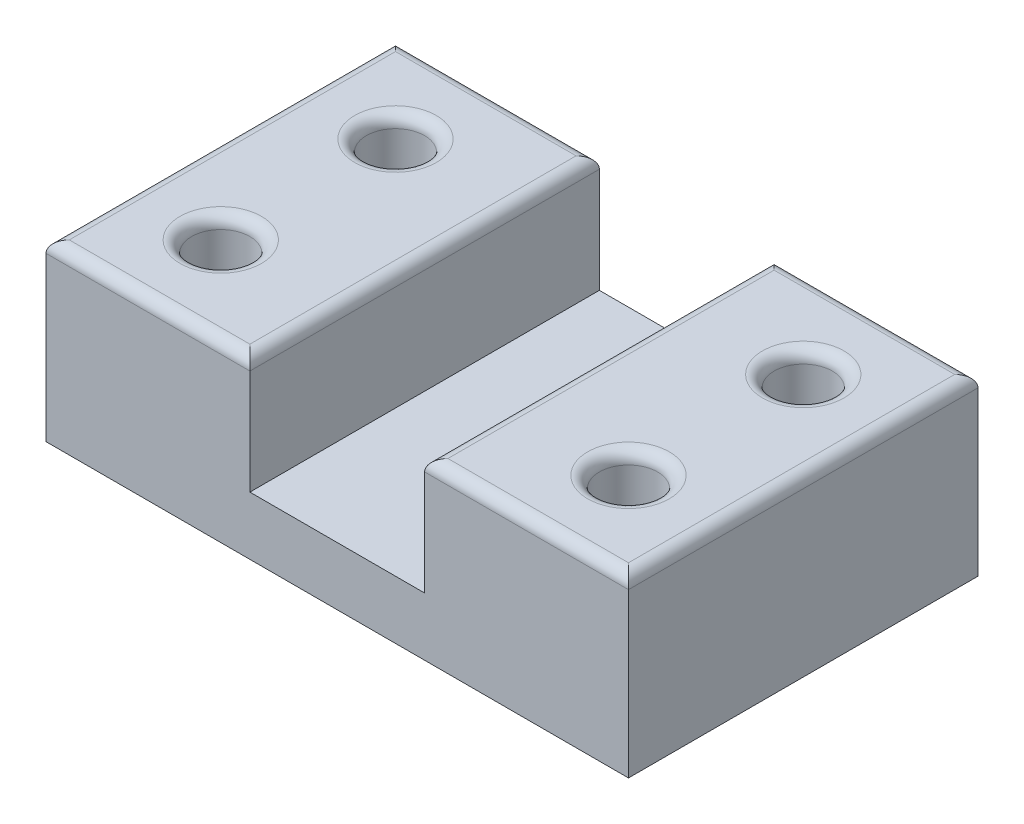
ISO-10303-21;
HEADER;
FILE_DESCRIPTION(('STEP AP214'),'2;1');
FILE_NAME('part.step','',(''),(''),'','','');
FILE_SCHEMA(('AUTOMOTIVE_DESIGN { 1 0 10303 214 1 1 1 1 }'));
ENDSEC;
DATA;
#1=APPLICATION_CONTEXT('core data for automotive mechanical design processes');
#2=APPLICATION_PROTOCOL_DEFINITION('international standard','automotive_design',2000,#1);
#3=PRODUCT_CONTEXT('',#1,'mechanical');
#4=PRODUCT('Part','Part','',(#3));
#5=PRODUCT_RELATED_PRODUCT_CATEGORY('part','',(#4));
#6=PRODUCT_DEFINITION_FORMATION('','',#4);
#7=PRODUCT_DEFINITION_CONTEXT('part definition',#1,'design');
#8=PRODUCT_DEFINITION('design','',#6,#7);
#9=PRODUCT_DEFINITION_SHAPE('','',#8);
#10=(LENGTH_UNIT() NAMED_UNIT(*) SI_UNIT(.MILLI.,.METRE.));
#11=(NAMED_UNIT(*) PLANE_ANGLE_UNIT() SI_UNIT($,.RADIAN.));
#12=(NAMED_UNIT(*) SI_UNIT($,.STERADIAN.) SOLID_ANGLE_UNIT());
#13=UNCERTAINTY_MEASURE_WITH_UNIT(LENGTH_MEASURE(1.E-05),#10,'distance_accuracy_value','');
#14=(GEOMETRIC_REPRESENTATION_CONTEXT(3) GLOBAL_UNCERTAINTY_ASSIGNED_CONTEXT((#13)) GLOBAL_UNIT_ASSIGNED_CONTEXT((#10,
#11,#12)) REPRESENTATION_CONTEXT('',''));
#15=CARTESIAN_POINT('',(0.,0.,0.));
#16=DIRECTION('',(0.,0.,1.));
#17=DIRECTION('',(1.,0.,0.));
#18=AXIS2_PLACEMENT_3D('',#15,#16,#17);
#19=CARTESIAN_POINT('',(-12.257964558671,25.4,76.2));
#20=DIRECTION('',(0.,-1.,0.));
#21=DIRECTION('',(1.,0.,0.));
#22=AXIS2_PLACEMENT_3D('',#19,#20,#21);
#23=PLANE('',#22);
#24=DIRECTION('',(-1.,0.,0.));
#25=VECTOR('',#24,1.);
#26=CARTESIAN_POINT('',(-12.257964558671,25.4,73.66));
#27=LINE('',#26,#25);
#28=CARTESIAN_POINT('',(-54.167964558671,25.4,73.66));
#29=VERTEX_POINT('',#28);
#30=CARTESIAN_POINT('',(-14.797964558671,25.4,73.66));
#31=VERTEX_POINT('',#30);
#32=EDGE_CURVE('E59',#29,#31,#27,.F.);
#33=ORIENTED_EDGE('',*,*,#32,.T.);
#34=DIRECTION('',(0.,0.,-1.));
#35=VECTOR('',#34,1.);
#36=CARTESIAN_POINT('',(-14.797964558671,25.4,76.2));
#37=LINE('',#36,#35);
#38=CARTESIAN_POINT('',(-14.797964558671,25.4,2.54));
#39=VERTEX_POINT('',#38);
#40=EDGE_CURVE('E267',#31,#39,#37,.T.);
#41=ORIENTED_EDGE('',*,*,#40,.T.);
#42=DIRECTION('',(-1.,0.,0.));
#43=VECTOR('',#42,1.);
#44=CARTESIAN_POINT('',(-12.257964558671,25.4,2.54));
#45=LINE('',#44,#43);
#46=CARTESIAN_POINT('',(-54.167964558671,25.4,2.54));
#47=VERTEX_POINT('',#46);
#48=EDGE_CURVE('E260',#39,#47,#45,.T.);
#49=ORIENTED_EDGE('',*,*,#48,.T.);
#50=DIRECTION('',(0.,0.,-1.));
#51=VECTOR('',#50,1.);
#52=CARTESIAN_POINT('',(-54.167964558671,25.4,76.2));
#53=LINE('',#52,#51);
#54=EDGE_CURVE('E64',#47,#29,#53,.F.);
#55=ORIENTED_EDGE('',*,*,#54,.T.);
#56=EDGE_LOOP('',(#33,#41,#49,#55));
#57=FACE_BOUND('',#56,.T.);
#58=CARTESIAN_POINT('',(-37.657964558671,25.4,19.05));
#59=DIRECTION('',(0.,-1.,0.));
#60=DIRECTION('',(1.,0.,0.));
#61=AXIS2_PLACEMENT_3D('',#58,#59,#60);
#62=CIRCLE('',#61,8.89);
#63=CARTESIAN_POINT('',(-28.767964558671,25.4,19.05));
#64=VERTEX_POINT('',#63);
#65=EDGE_CURVE('E256',#64,#64,#62,.T.);
#66=ORIENTED_EDGE('',*,*,#65,.T.);
#67=EDGE_LOOP('',(#66));
#68=FACE_BOUND('',#67,.T.);
#69=CARTESIAN_POINT('',(-37.657964558671,25.4,57.15));
#70=DIRECTION('',(0.,-1.,0.));
#71=DIRECTION('',(1.,0.,0.));
#72=AXIS2_PLACEMENT_3D('',#69,#70,#71);
#73=CIRCLE('',#72,8.89);
#74=CARTESIAN_POINT('',(-28.767964558671,25.4,57.15));
#75=VERTEX_POINT('',#74);
#76=EDGE_CURVE('E252',#75,#75,#73,.T.);
#77=ORIENTED_EDGE('',*,*,#76,.T.);
#78=EDGE_LOOP('',(#77));
#79=FACE_BOUND('',#78,.T.);
#80=ADVANCED_FACE('F41',(#57,#68,#79),#23,.F.);
#81=CARTESIAN_POINT('',(-56.707964558671,25.4,76.2));
#82=DIRECTION('',(1.,0.,0.));
#83=DIRECTION('',(0.,0.,-1.));
#84=AXIS2_PLACEMENT_3D('',#81,#82,#83);
#85=PLANE('',#84);
#86=DIRECTION('',(0.,-1.,0.));
#87=VECTOR('',#86,1.);
#88=CARTESIAN_POINT('',(-56.707964558671,25.4,76.2));
#89=LINE('',#88,#87);
#90=CARTESIAN_POINT('',(-56.707964558671,22.86,76.2));
#91=VERTEX_POINT('',#90);
#92=CARTESIAN_POINT('',(-56.707964558671,-12.7,76.2));
#93=VERTEX_POINT('',#92);
#94=EDGE_CURVE('E132',#91,#93,#89,.T.);
#95=ORIENTED_EDGE('',*,*,#94,.F.);
#96=DIRECTION('',(0.,0.,-1.));
#97=VECTOR('',#96,1.);
#98=CARTESIAN_POINT('',(-56.707964558671,22.86,76.2));
#99=LINE('',#98,#97);
#100=CARTESIAN_POINT('',(-56.707964558671,22.86,0.));
#101=VERTEX_POINT('',#100);
#102=EDGE_CURVE('E274',#91,#101,#99,.T.);
#103=ORIENTED_EDGE('',*,*,#102,.T.);
#104=DIRECTION('',(0.,-1.,0.));
#105=VECTOR('',#104,1.);
#106=CARTESIAN_POINT('',(-56.707964558671,25.4,0.));
#107=LINE('',#106,#105);
#108=CARTESIAN_POINT('',(-56.707964558671,-12.7,0.));
#109=VERTEX_POINT('',#108);
#110=EDGE_CURVE('E151',#101,#109,#107,.T.);
#111=ORIENTED_EDGE('',*,*,#110,.T.);
#112=DIRECTION('',(0.,0.,-1.));
#113=VECTOR('',#112,1.);
#114=CARTESIAN_POINT('',(-56.707964558671,-12.7,76.2));
#115=LINE('',#114,#113);
#116=EDGE_CURVE('E148',#93,#109,#115,.T.);
#117=ORIENTED_EDGE('',*,*,#116,.F.);
#118=EDGE_LOOP('',(#95,#103,#111,#117));
#119=FACE_BOUND('',#118,.T.);
#120=ADVANCED_FACE('F149',(#119),#85,.F.);
#121=CARTESIAN_POINT('',(-56.707964558671,-12.7,76.2));
#122=DIRECTION('',(0.,1.,0.));
#123=DIRECTION('',(0.,0.,1.));
#124=AXIS2_PLACEMENT_3D('',#121,#122,#123);
#125=PLANE('',#124);
#126=CARTESIAN_POINT('',(-37.657964558671,-12.7,57.15));
#127=DIRECTION('',(0.,1.,0.));
#128=DIRECTION('',(-1.,0.,0.));
#129=AXIS2_PLACEMENT_3D('',#126,#127,#128);
#130=CIRCLE('',#129,6.35);
#131=CARTESIAN_POINT('',(-44.007964558671,-12.7,57.15));
#132=VERTEX_POINT('',#131);
#133=EDGE_CURVE('E378',#132,#132,#130,.T.);
#134=ORIENTED_EDGE('',*,*,#133,.T.);
#135=EDGE_LOOP('',(#134));
#136=FACE_BOUND('',#135,.T.);
#137=CARTESIAN_POINT('',(51.242035441329,-12.7,19.05));
#138=DIRECTION('',(0.,1.,0.));
#139=DIRECTION('',(-1.,0.,0.));
#140=AXIS2_PLACEMENT_3D('',#137,#138,#139);
#141=CIRCLE('',#140,6.35);
#142=CARTESIAN_POINT('',(44.892035441329,-12.7,19.05));
#143=VERTEX_POINT('',#142);
#144=EDGE_CURVE('E381',#143,#143,#141,.T.);
#145=ORIENTED_EDGE('',*,*,#144,.T.);
#146=EDGE_LOOP('',(#145));
#147=FACE_BOUND('',#146,.T.);
#148=CARTESIAN_POINT('',(51.242035441329,-12.7,57.15));
#149=DIRECTION('',(0.,1.,0.));
#150=DIRECTION('',(-1.,0.,0.));
#151=AXIS2_PLACEMENT_3D('',#148,#149,#150);
#152=CIRCLE('',#151,6.35);
#153=CARTESIAN_POINT('',(44.892035441329,-12.7,57.15));
#154=VERTEX_POINT('',#153);
#155=EDGE_CURVE('E294',#154,#154,#152,.T.);
#156=ORIENTED_EDGE('',*,*,#155,.T.);
#157=EDGE_LOOP('',(#156));
#158=FACE_BOUND('',#157,.T.);
#159=CARTESIAN_POINT('',(-37.657964558671,-12.7,19.05));
#160=DIRECTION('',(0.,1.,0.));
#161=DIRECTION('',(-1.,0.,0.));
#162=AXIS2_PLACEMENT_3D('',#159,#160,#161);
#163=CIRCLE('',#162,6.35);
#164=CARTESIAN_POINT('',(-44.007964558671,-12.7,19.05));
#165=VERTEX_POINT('',#164);
#166=EDGE_CURVE('E181',#165,#165,#163,.T.);
#167=ORIENTED_EDGE('',*,*,#166,.T.);
#168=EDGE_LOOP('',(#167));
#169=FACE_BOUND('',#168,.T.);
#170=DIRECTION('',(1.,0.,0.));
#171=VECTOR('',#170,1.);
#172=CARTESIAN_POINT('',(-56.707964558671,-12.7,0.));
#173=LINE('',#172,#171);
#174=CARTESIAN_POINT('',(70.292035441329,-12.7,0.));
#175=VERTEX_POINT('',#174);
#176=EDGE_CURVE('E180',#109,#175,#173,.T.);
#177=ORIENTED_EDGE('',*,*,#176,.T.);
#178=DIRECTION('',(0.,0.,-1.));
#179=VECTOR('',#178,1.);
#180=CARTESIAN_POINT('',(70.292035441329,-12.7,76.2));
#181=LINE('',#180,#179);
#182=CARTESIAN_POINT('',(70.292035441329,-12.7,76.2));
#183=VERTEX_POINT('',#182);
#184=EDGE_CURVE('E156',#183,#175,#181,.T.);
#185=ORIENTED_EDGE('',*,*,#184,.F.);
#186=DIRECTION('',(1.,0.,0.));
#187=VECTOR('',#186,1.);
#188=CARTESIAN_POINT('',(-56.707964558671,-12.7,76.2));
#189=LINE('',#188,#187);
#190=EDGE_CURVE('E137',#93,#183,#189,.T.);
#191=ORIENTED_EDGE('',*,*,#190,.F.);
#192=ORIENTED_EDGE('',*,*,#116,.T.);
#193=EDGE_LOOP('',(#177,#185,#191,#192));
#194=FACE_BOUND('',#193,.T.);
#195=ADVANCED_FACE('F158',(#136,#147,#158,#169,#194),#125,.F.);
#196=CARTESIAN_POINT('',(70.292035441329,-12.7,76.2));
#197=DIRECTION('',(-1.,0.,0.));
#198=DIRECTION('',(0.,0.,1.));
#199=AXIS2_PLACEMENT_3D('',#196,#197,#198);
#200=PLANE('',#199);
#201=DIRECTION('',(0.,1.,0.));
#202=VECTOR('',#201,1.);
#203=CARTESIAN_POINT('',(70.292035441329,-12.7,0.));
#204=LINE('',#203,#202);
#205=CARTESIAN_POINT('',(70.292035441329,22.86,0.));
#206=VERTEX_POINT('',#205);
#207=EDGE_CURVE('E184',#175,#206,#204,.T.);
#208=ORIENTED_EDGE('',*,*,#207,.T.);
#209=DIRECTION('',(0.,0.,-1.));
#210=VECTOR('',#209,1.);
#211=CARTESIAN_POINT('',(70.292035441329,22.86,76.2));
#212=LINE('',#211,#210);
#213=CARTESIAN_POINT('',(70.292035441329,22.86,76.2));
#214=VERTEX_POINT('',#213);
#215=EDGE_CURVE('E226',#206,#214,#212,.F.);
#216=ORIENTED_EDGE('',*,*,#215,.T.);
#217=DIRECTION('',(0.,1.,0.));
#218=VECTOR('',#217,1.);
#219=CARTESIAN_POINT('',(70.292035441329,-12.7,76.2));
#220=LINE('',#219,#218);
#221=EDGE_CURVE('E162',#183,#214,#220,.T.);
#222=ORIENTED_EDGE('',*,*,#221,.F.);
#223=ORIENTED_EDGE('',*,*,#184,.T.);
#224=EDGE_LOOP('',(#208,#216,#222,#223));
#225=FACE_BOUND('',#224,.T.);
#226=ADVANCED_FACE('F319',(#225),#200,.F.);
#227=CARTESIAN_POINT('',(70.292035441329,25.4,76.2));
#228=DIRECTION('',(0.,-1.,0.));
#229=DIRECTION('',(1.,0.,0.));
#230=AXIS2_PLACEMENT_3D('',#227,#228,#229);
#231=PLANE('',#230);
#232=DIRECTION('',(-1.,0.,0.));
#233=VECTOR('',#232,1.);
#234=CARTESIAN_POINT('',(70.292035441329,25.4,73.66));
#235=LINE('',#234,#233);
#236=CARTESIAN_POINT('',(28.382035441329,25.4,73.66));
#237=VERTEX_POINT('',#236);
#238=CARTESIAN_POINT('',(67.752035441329,25.4,73.66));
#239=VERTEX_POINT('',#238);
#240=EDGE_CURVE('E219',#237,#239,#235,.F.);
#241=ORIENTED_EDGE('',*,*,#240,.T.);
#242=DIRECTION('',(0.,0.,-1.));
#243=VECTOR('',#242,1.);
#244=CARTESIAN_POINT('',(67.752035441329,25.4,76.2));
#245=LINE('',#244,#243);
#246=CARTESIAN_POINT('',(67.752035441329,25.4,2.54));
#247=VERTEX_POINT('',#246);
#248=EDGE_CURVE('E222',#239,#247,#245,.T.);
#249=ORIENTED_EDGE('',*,*,#248,.T.);
#250=DIRECTION('',(-1.,0.,0.));
#251=VECTOR('',#250,1.);
#252=CARTESIAN_POINT('',(70.292035441329,25.4,2.54));
#253=LINE('',#252,#251);
#254=CARTESIAN_POINT('',(28.382035441329,25.4,2.54));
#255=VERTEX_POINT('',#254);
#256=EDGE_CURVE('E213',#247,#255,#253,.T.);
#257=ORIENTED_EDGE('',*,*,#256,.T.);
#258=DIRECTION('',(0.,0.,-1.));
#259=VECTOR('',#258,1.);
#260=CARTESIAN_POINT('',(28.382035441329,25.4,76.2));
#261=LINE('',#260,#259);
#262=EDGE_CURVE('E216',#255,#237,#261,.F.);
#263=ORIENTED_EDGE('',*,*,#262,.T.);
#264=EDGE_LOOP('',(#241,#249,#257,#263));
#265=FACE_BOUND('',#264,.T.);
#266=CARTESIAN_POINT('',(51.242035441329,25.4,57.15));
#267=DIRECTION('',(0.,-1.,0.));
#268=DIRECTION('',(1.,0.,0.));
#269=AXIS2_PLACEMENT_3D('',#266,#267,#268);
#270=CIRCLE('',#269,8.89);
#271=CARTESIAN_POINT('',(60.132035441329,25.4,57.15));
#272=VERTEX_POINT('',#271);
#273=EDGE_CURVE('E209',#272,#272,#270,.T.);
#274=ORIENTED_EDGE('',*,*,#273,.T.);
#275=EDGE_LOOP('',(#274));
#276=FACE_BOUND('',#275,.T.);
#277=CARTESIAN_POINT('',(51.242035441329,25.4,19.05));
#278=DIRECTION('',(0.,-1.,0.));
#279=DIRECTION('',(1.,0.,0.));
#280=AXIS2_PLACEMENT_3D('',#277,#278,#279);
#281=CIRCLE('',#280,8.89);
#282=CARTESIAN_POINT('',(60.132035441329,25.4,19.05));
#283=VERTEX_POINT('',#282);
#284=EDGE_CURVE('E155',#283,#283,#281,.T.);
#285=ORIENTED_EDGE('',*,*,#284,.T.);
#286=EDGE_LOOP('',(#285));
#287=FACE_BOUND('',#286,.T.);
#288=ADVANCED_FACE('F340',(#265,#276,#287),#231,.F.);
#289=CARTESIAN_POINT('',(25.842035441329,25.4,76.2));
#290=DIRECTION('',(1.,0.,0.));
#291=DIRECTION('',(0.,1.,0.));
#292=AXIS2_PLACEMENT_3D('',#289,#290,#291);
#293=PLANE('',#292);
#294=DIRECTION('',(0.,-1.,0.));
#295=VECTOR('',#294,1.);
#296=CARTESIAN_POINT('',(25.842035441329,25.4,76.2));
#297=LINE('',#296,#295);
#298=CARTESIAN_POINT('',(25.842035441329,22.86,76.2));
#299=VERTEX_POINT('',#298);
#300=CARTESIAN_POINT('',(25.842035441329,0.,76.2));
#301=VERTEX_POINT('',#300);
#302=EDGE_CURVE('E165',#299,#301,#297,.T.);
#303=ORIENTED_EDGE('',*,*,#302,.F.);
#304=DIRECTION('',(0.,0.,-1.));
#305=VECTOR('',#304,1.);
#306=CARTESIAN_POINT('',(25.842035441329,22.86,76.2));
#307=LINE('',#306,#305);
#308=CARTESIAN_POINT('',(25.842035441329,22.86,0.));
#309=VERTEX_POINT('',#308);
#310=EDGE_CURVE('E235',#299,#309,#307,.T.);
#311=ORIENTED_EDGE('',*,*,#310,.T.);
#312=DIRECTION('',(0.,-1.,0.));
#313=VECTOR('',#312,1.);
#314=CARTESIAN_POINT('',(25.842035441329,25.4,0.));
#315=LINE('',#314,#313);
#316=CARTESIAN_POINT('',(25.842035441329,0.,0.));
#317=VERTEX_POINT('',#316);
#318=EDGE_CURVE('E188',#309,#317,#315,.T.);
#319=ORIENTED_EDGE('',*,*,#318,.T.);
#320=DIRECTION('',(0.,0.,-1.));
#321=VECTOR('',#320,1.);
#322=CARTESIAN_POINT('',(25.842035441329,0.,76.2));
#323=LINE('',#322,#321);
#324=EDGE_CURVE('E200',#301,#317,#323,.T.);
#325=ORIENTED_EDGE('',*,*,#324,.F.);
#326=EDGE_LOOP('',(#303,#311,#319,#325));
#327=FACE_BOUND('',#326,.T.);
#328=ADVANCED_FACE('F328',(#327),#293,.F.);
#329=CARTESIAN_POINT('',(25.842035441329,0.,76.2));
#330=DIRECTION('',(0.,-1.,0.));
#331=DIRECTION('',(1.,0.,0.));
#332=AXIS2_PLACEMENT_3D('',#329,#330,#331);
#333=PLANE('',#332);
#334=DIRECTION('',(-1.,0.,0.));
#335=VECTOR('',#334,1.);
#336=CARTESIAN_POINT('',(25.842035441329,0.,0.));
#337=LINE('',#336,#335);
#338=CARTESIAN_POINT('',(-12.257964558671,0.,0.));
#339=VERTEX_POINT('',#338);
#340=EDGE_CURVE('E191',#317,#339,#337,.T.);
#341=ORIENTED_EDGE('',*,*,#340,.T.);
#342=DIRECTION('',(0.,0.,-1.));
#343=VECTOR('',#342,1.);
#344=CARTESIAN_POINT('',(-12.257964558671,0.,76.2));
#345=LINE('',#344,#343);
#346=CARTESIAN_POINT('',(-12.257964558671,0.,76.2));
#347=VERTEX_POINT('',#346);
#348=EDGE_CURVE('E177',#347,#339,#345,.T.);
#349=ORIENTED_EDGE('',*,*,#348,.F.);
#350=DIRECTION('',(-1.,0.,0.));
#351=VECTOR('',#350,1.);
#352=CARTESIAN_POINT('',(25.842035441329,0.,76.2));
#353=LINE('',#352,#351);
#354=EDGE_CURVE('E171',#301,#347,#353,.T.);
#355=ORIENTED_EDGE('',*,*,#354,.F.);
#356=ORIENTED_EDGE('',*,*,#324,.T.);
#357=EDGE_LOOP('',(#341,#349,#355,#356));
#358=FACE_BOUND('',#357,.T.);
#359=ADVANCED_FACE('F348',(#358),#333,.F.);
#360=CARTESIAN_POINT('',(-12.257964558671,0.,76.2));
#361=DIRECTION('',(-1.,0.,0.));
#362=DIRECTION('',(0.,-1.,0.));
#363=AXIS2_PLACEMENT_3D('',#360,#361,#362);
#364=PLANE('',#363);
#365=DIRECTION('',(0.,1.,0.));
#366=VECTOR('',#365,1.);
#367=CARTESIAN_POINT('',(-12.257964558671,0.,0.));
#368=LINE('',#367,#366);
#369=CARTESIAN_POINT('',(-12.257964558671,22.86,0.));
#370=VERTEX_POINT('',#369);
#371=EDGE_CURVE('E145',#339,#370,#368,.T.);
#372=ORIENTED_EDGE('',*,*,#371,.T.);
#373=DIRECTION('',(0.,0.,-1.));
#374=VECTOR('',#373,1.);
#375=CARTESIAN_POINT('',(-12.257964558671,22.86,76.2));
#376=LINE('',#375,#374);
#377=CARTESIAN_POINT('',(-12.257964558671,22.86,76.2));
#378=VERTEX_POINT('',#377);
#379=EDGE_CURVE('E270',#370,#378,#376,.F.);
#380=ORIENTED_EDGE('',*,*,#379,.T.);
#381=DIRECTION('',(0.,1.,0.));
#382=VECTOR('',#381,1.);
#383=CARTESIAN_POINT('',(-12.257964558671,0.,76.2));
#384=LINE('',#383,#382);
#385=EDGE_CURVE('E174',#347,#378,#384,.T.);
#386=ORIENTED_EDGE('',*,*,#385,.F.);
#387=ORIENTED_EDGE('',*,*,#348,.T.);
#388=EDGE_LOOP('',(#372,#380,#386,#387));
#389=FACE_BOUND('',#388,.T.);
#390=ADVANCED_FACE('F352',(#389),#364,.F.);
#391=CARTESIAN_POINT('',(0.,0.,76.2));
#392=DIRECTION('',(0.,0.,1.));
#393=DIRECTION('',(1.,0.,0.));
#394=AXIS2_PLACEMENT_3D('',#391,#392,#393);
#395=PLANE('',#394);
#396=ORIENTED_EDGE('',*,*,#221,.T.);
#397=DIRECTION('',(-1.,0.,0.));
#398=VECTOR('',#397,1.);
#399=CARTESIAN_POINT('',(25.842035441329,22.86,76.2));
#400=LINE('',#399,#398);
#401=EDGE_CURVE('E232',#214,#299,#400,.T.);
#402=ORIENTED_EDGE('',*,*,#401,.T.);
#403=ORIENTED_EDGE('',*,*,#302,.T.);
#404=ORIENTED_EDGE('',*,*,#354,.T.);
#405=ORIENTED_EDGE('',*,*,#385,.T.);
#406=DIRECTION('',(-1.,0.,0.));
#407=VECTOR('',#406,1.);
#408=CARTESIAN_POINT('',(-56.707964558671,22.86,76.2));
#409=LINE('',#408,#407);
#410=EDGE_CURVE('E141',#378,#91,#409,.T.);
#411=ORIENTED_EDGE('',*,*,#410,.T.);
#412=ORIENTED_EDGE('',*,*,#94,.T.);
#413=ORIENTED_EDGE('',*,*,#190,.T.);
#414=EDGE_LOOP('',(#396,#402,#403,#404,#405,#411,#412,#413));
#415=FACE_BOUND('',#414,.T.);
#416=ADVANCED_FACE('F135',(#415),#395,.T.);
#417=CARTESIAN_POINT('',(0.,0.,0.));
#418=DIRECTION('',(0.,0.,1.));
#419=DIRECTION('',(1.,0.,0.));
#420=AXIS2_PLACEMENT_3D('',#417,#418,#419);
#421=PLANE('',#420);
#422=ORIENTED_EDGE('',*,*,#318,.F.);
#423=DIRECTION('',(-1.,0.,0.));
#424=VECTOR('',#423,1.);
#425=CARTESIAN_POINT('',(0.,22.86,0.));
#426=LINE('',#425,#424);
#427=EDGE_CURVE('E241',#309,#206,#426,.F.);
#428=ORIENTED_EDGE('',*,*,#427,.T.);
#429=ORIENTED_EDGE('',*,*,#207,.F.);
#430=ORIENTED_EDGE('',*,*,#176,.F.);
#431=ORIENTED_EDGE('',*,*,#110,.F.);
#432=DIRECTION('',(-1.,0.,0.));
#433=VECTOR('',#432,1.);
#434=CARTESIAN_POINT('',(0.,22.86,0.));
#435=LINE('',#434,#433);
#436=EDGE_CURVE('E238',#101,#370,#435,.F.);
#437=ORIENTED_EDGE('',*,*,#436,.T.);
#438=ORIENTED_EDGE('',*,*,#371,.F.);
#439=ORIENTED_EDGE('',*,*,#340,.F.);
#440=EDGE_LOOP('',(#422,#428,#429,#430,#431,#437,#438,#439));
#441=FACE_BOUND('',#440,.T.);
#442=ADVANCED_FACE('F315',(#441),#421,.F.);
#443=CARTESIAN_POINT('',(51.242035441329,-12.7,57.15));
#444=DIRECTION('',(0.,1.,0.));
#445=DIRECTION('',(-1.,0.,0.));
#446=AXIS2_PLACEMENT_3D('',#443,#444,#445);
#447=CYLINDRICAL_SURFACE('',#446,6.35);
#448=CARTESIAN_POINT('',(51.242035441329,22.86,57.15));
#449=DIRECTION('',(0.,-1.,0.));
#450=DIRECTION('',(1.,0.,0.));
#451=AXIS2_PLACEMENT_3D('',#448,#449,#450);
#452=CIRCLE('',#451,6.35);
#453=CARTESIAN_POINT('',(57.592035441329,22.86,57.15));
#454=VERTEX_POINT('',#453);
#455=EDGE_CURVE('E244',#454,#454,#452,.F.);
#456=ORIENTED_EDGE('',*,*,#455,.T.);
#457=EDGE_LOOP('',(#456));
#458=FACE_BOUND('',#457,.T.);
#459=ORIENTED_EDGE('',*,*,#155,.F.);
#460=EDGE_LOOP('',(#459));
#461=FACE_BOUND('',#460,.T.);
#462=ADVANCED_FACE('F395',(#458,#461),#447,.F.);
#463=CARTESIAN_POINT('',(51.242035441329,-12.7,19.05));
#464=DIRECTION('',(0.,1.,0.));
#465=DIRECTION('',(-1.,0.,0.));
#466=AXIS2_PLACEMENT_3D('',#463,#464,#465);
#467=CYLINDRICAL_SURFACE('',#466,6.35);
#468=CARTESIAN_POINT('',(51.242035441329,22.86,19.05));
#469=DIRECTION('',(0.,-1.,0.));
#470=DIRECTION('',(1.,0.,0.));
#471=AXIS2_PLACEMENT_3D('',#468,#469,#470);
#472=CIRCLE('',#471,6.35);
#473=CARTESIAN_POINT('',(57.592035441329,22.86,19.05));
#474=VERTEX_POINT('',#473);
#475=EDGE_CURVE('E248',#474,#474,#472,.F.);
#476=ORIENTED_EDGE('',*,*,#475,.T.);
#477=EDGE_LOOP('',(#476));
#478=FACE_BOUND('',#477,.T.);
#479=ORIENTED_EDGE('',*,*,#144,.F.);
#480=EDGE_LOOP('',(#479));
#481=FACE_BOUND('',#480,.T.);
#482=ADVANCED_FACE('F397',(#478,#481),#467,.F.);
#483=CARTESIAN_POINT('',(-37.657964558671,-12.7,19.05));
#484=DIRECTION('',(0.,1.,0.));
#485=DIRECTION('',(-1.,0.,0.));
#486=AXIS2_PLACEMENT_3D('',#483,#484,#485);
#487=CYLINDRICAL_SURFACE('',#486,6.35);
#488=CARTESIAN_POINT('',(-37.657964558671,22.86,19.05));
#489=DIRECTION('',(0.,-1.,0.));
#490=DIRECTION('',(1.,0.,0.));
#491=AXIS2_PLACEMENT_3D('',#488,#489,#490);
#492=CIRCLE('',#491,6.35);
#493=CARTESIAN_POINT('',(-31.307964558671,22.86,19.05));
#494=VERTEX_POINT('',#493);
#495=EDGE_CURVE('E51',#494,#494,#492,.F.);
#496=ORIENTED_EDGE('',*,*,#495,.T.);
#497=EDGE_LOOP('',(#496));
#498=FACE_BOUND('',#497,.T.);
#499=ORIENTED_EDGE('',*,*,#166,.F.);
#500=EDGE_LOOP('',(#499));
#501=FACE_BOUND('',#500,.T.);
#502=ADVANCED_FACE('F374',(#498,#501),#487,.F.);
#503=CARTESIAN_POINT('',(-37.657964558671,-12.7,57.15));
#504=DIRECTION('',(0.,1.,0.));
#505=DIRECTION('',(-1.,0.,0.));
#506=AXIS2_PLACEMENT_3D('',#503,#504,#505);
#507=CYLINDRICAL_SURFACE('',#506,6.35);
#508=CARTESIAN_POINT('',(-37.657964558671,22.86,57.15));
#509=DIRECTION('',(0.,-1.,0.));
#510=DIRECTION('',(1.,0.,0.));
#511=AXIS2_PLACEMENT_3D('',#508,#509,#510);
#512=CIRCLE('',#511,6.35);
#513=CARTESIAN_POINT('',(-31.307964558671,22.86,57.15));
#514=VERTEX_POINT('',#513);
#515=EDGE_CURVE('E11',#514,#514,#512,.F.);
#516=ORIENTED_EDGE('',*,*,#515,.T.);
#517=EDGE_LOOP('',(#516));
#518=FACE_BOUND('',#517,.T.);
#519=ORIENTED_EDGE('',*,*,#133,.F.);
#520=EDGE_LOOP('',(#519));
#521=FACE_BOUND('',#520,.T.);
#522=ADVANCED_FACE('F371',(#518,#521),#507,.F.);
#523=CARTESIAN_POINT('',(28.382035441329,22.86,76.2));
#524=DIRECTION('',(0.,0.,-1.));
#525=DIRECTION('',(-1.,0.,0.));
#526=AXIS2_PLACEMENT_3D('',#523,#524,#525);
#527=CYLINDRICAL_SURFACE('',#526,2.54);
#528=CARTESIAN_POINT('',(28.382035441329,22.86,2.54));
#529=DIRECTION('',(-0.707106781186547,0.,0.707106781186547));
#530=DIRECTION('',(-0.707106781186547,0.,-0.707106781186547));
#531=AXIS2_PLACEMENT_3D('',#528,#529,#530);
#532=ELLIPSE('',#531,3.59210244842766,2.54);
#533=EDGE_CURVE('E286',#309,#255,#532,.F.);
#534=ORIENTED_EDGE('',*,*,#533,.F.);
#535=ORIENTED_EDGE('',*,*,#310,.F.);
#536=CARTESIAN_POINT('',(28.382035441329,22.86,73.66));
#537=DIRECTION('',(-0.707106781186547,0.,-0.707106781186547));
#538=DIRECTION('',(0.707106781186547,0.,-0.707106781186547));
#539=AXIS2_PLACEMENT_3D('',#536,#537,#538);
#540=ELLIPSE('',#539,3.59210244842766,2.54);
#541=EDGE_CURVE('E290',#237,#299,#540,.F.);
#542=ORIENTED_EDGE('',*,*,#541,.F.);
#543=ORIENTED_EDGE('',*,*,#262,.F.);
#544=EDGE_LOOP('',(#534,#535,#542,#543));
#545=FACE_BOUND('',#544,.T.);
#546=ADVANCED_FACE('F333',(#545),#527,.T.);
#547=CARTESIAN_POINT('',(0.,22.86,73.66));
#548=DIRECTION('',(1.,0.,0.));
#549=DIRECTION('',(0.,1.,0.));
#550=AXIS2_PLACEMENT_3D('',#547,#548,#549);
#551=CYLINDRICAL_SURFACE('',#550,2.54);
#552=ORIENTED_EDGE('',*,*,#541,.T.);
#553=ORIENTED_EDGE('',*,*,#401,.F.);
#554=CARTESIAN_POINT('',(67.752035441329,22.86,73.66));
#555=DIRECTION('',(0.707106781186547,0.,-0.707106781186547));
#556=DIRECTION('',(0.707106781186547,0.,0.707106781186547));
#557=AXIS2_PLACEMENT_3D('',#554,#555,#556);
#558=ELLIPSE('',#557,3.59210244842766,2.54);
#559=EDGE_CURVE('E283',#239,#214,#558,.T.);
#560=ORIENTED_EDGE('',*,*,#559,.F.);
#561=ORIENTED_EDGE('',*,*,#240,.F.);
#562=EDGE_LOOP('',(#552,#553,#560,#561));
#563=FACE_BOUND('',#562,.T.);
#564=ADVANCED_FACE('F337',(#563),#551,.T.);
#565=CARTESIAN_POINT('',(70.292035441329,22.86,2.54));
#566=DIRECTION('',(-1.,0.,0.));
#567=DIRECTION('',(0.,-1.,0.));
#568=AXIS2_PLACEMENT_3D('',#565,#566,#567);
#569=CYLINDRICAL_SURFACE('',#568,2.54);
#570=ORIENTED_EDGE('',*,*,#533,.T.);
#571=ORIENTED_EDGE('',*,*,#256,.F.);
#572=CARTESIAN_POINT('',(67.752035441329,22.86,2.54));
#573=DIRECTION('',(-0.707106781186547,0.,-0.707106781186547));
#574=DIRECTION('',(-0.707106781186547,0.,0.707106781186547));
#575=AXIS2_PLACEMENT_3D('',#572,#573,#574);
#576=ELLIPSE('',#575,3.59210244842766,2.54);
#577=EDGE_CURVE('E280',#206,#247,#576,.F.);
#578=ORIENTED_EDGE('',*,*,#577,.F.);
#579=ORIENTED_EDGE('',*,*,#427,.F.);
#580=EDGE_LOOP('',(#570,#571,#578,#579));
#581=FACE_BOUND('',#580,.T.);
#582=ADVANCED_FACE('F344',(#581),#569,.T.);
#583=CARTESIAN_POINT('',(67.752035441329,22.86,76.2));
#584=DIRECTION('',(0.,0.,-1.));
#585=DIRECTION('',(-1.,0.,0.));
#586=AXIS2_PLACEMENT_3D('',#583,#584,#585);
#587=CYLINDRICAL_SURFACE('',#586,2.54);
#588=ORIENTED_EDGE('',*,*,#559,.T.);
#589=ORIENTED_EDGE('',*,*,#215,.F.);
#590=ORIENTED_EDGE('',*,*,#577,.T.);
#591=ORIENTED_EDGE('',*,*,#248,.F.);
#592=EDGE_LOOP('',(#588,#589,#590,#591));
#593=FACE_BOUND('',#592,.T.);
#594=ADVANCED_FACE('F427',(#593),#587,.T.);
#595=CARTESIAN_POINT('',(51.242035441329,22.86,57.15));
#596=DIRECTION('',(0.,-1.,0.));
#597=DIRECTION('',(1.,0.,0.));
#598=AXIS2_PLACEMENT_3D('',#595,#596,#597);
#599=TOROIDAL_SURFACE('',#598,8.89,2.54);
#600=ORIENTED_EDGE('',*,*,#273,.F.);
#601=EDGE_LOOP('',(#600));
#602=FACE_BOUND('',#601,.T.);
#603=ORIENTED_EDGE('',*,*,#455,.F.);
#604=EDGE_LOOP('',(#603));
#605=FACE_BOUND('',#604,.T.);
#606=ADVANCED_FACE('F430',(#602,#605),#599,.T.);
#607=CARTESIAN_POINT('',(51.242035441329,22.86,19.05));
#608=DIRECTION('',(0.,-1.,0.));
#609=DIRECTION('',(1.,0.,0.));
#610=AXIS2_PLACEMENT_3D('',#607,#608,#609);
#611=TOROIDAL_SURFACE('',#610,8.89,2.54);
#612=ORIENTED_EDGE('',*,*,#284,.F.);
#613=EDGE_LOOP('',(#612));
#614=FACE_BOUND('',#613,.T.);
#615=ORIENTED_EDGE('',*,*,#475,.F.);
#616=EDGE_LOOP('',(#615));
#617=FACE_BOUND('',#616,.T.);
#618=ADVANCED_FACE('F440',(#614,#617),#611,.T.);
#619=CARTESIAN_POINT('',(-54.167964558671,22.86,76.2));
#620=DIRECTION('',(0.,0.,-1.));
#621=DIRECTION('',(-1.,0.,0.));
#622=AXIS2_PLACEMENT_3D('',#619,#620,#621);
#623=CYLINDRICAL_SURFACE('',#622,2.54);
#624=CARTESIAN_POINT('',(-54.167964558671,22.86,2.54));
#625=DIRECTION('',(-0.707106781186547,0.,0.707106781186547));
#626=DIRECTION('',(-0.707106781186547,0.,-0.707106781186547));
#627=AXIS2_PLACEMENT_3D('',#624,#625,#626);
#628=ELLIPSE('',#627,3.59210244842766,2.54);
#629=EDGE_CURVE('E300',#101,#47,#628,.F.);
#630=ORIENTED_EDGE('',*,*,#629,.F.);
#631=ORIENTED_EDGE('',*,*,#102,.F.);
#632=CARTESIAN_POINT('',(-54.167964558671,22.86,73.66));
#633=DIRECTION('',(-0.707106781186547,0.,-0.707106781186547));
#634=DIRECTION('',(0.707106781186547,0.,-0.707106781186547));
#635=AXIS2_PLACEMENT_3D('',#632,#633,#634);
#636=ELLIPSE('',#635,3.59210244842766,2.54);
#637=EDGE_CURVE('E45',#29,#91,#636,.F.);
#638=ORIENTED_EDGE('',*,*,#637,.F.);
#639=ORIENTED_EDGE('',*,*,#54,.F.);
#640=EDGE_LOOP('',(#630,#631,#638,#639));
#641=FACE_BOUND('',#640,.T.);
#642=ADVANCED_FACE('F312',(#641),#623,.T.);
#643=CARTESIAN_POINT('',(0.,22.86,73.66));
#644=DIRECTION('',(1.,0.,0.));
#645=DIRECTION('',(0.,1.,0.));
#646=AXIS2_PLACEMENT_3D('',#643,#644,#645);
#647=CYLINDRICAL_SURFACE('',#646,2.54);
#648=ORIENTED_EDGE('',*,*,#637,.T.);
#649=ORIENTED_EDGE('',*,*,#410,.F.);
#650=CARTESIAN_POINT('',(-14.797964558671,22.86,73.66));
#651=DIRECTION('',(0.707106781186547,0.,-0.707106781186547));
#652=DIRECTION('',(0.707106781186547,0.,0.707106781186547));
#653=AXIS2_PLACEMENT_3D('',#650,#651,#652);
#654=ELLIPSE('',#653,3.59210244842766,2.54);
#655=EDGE_CURVE('E298',#31,#378,#654,.T.);
#656=ORIENTED_EDGE('',*,*,#655,.F.);
#657=ORIENTED_EDGE('',*,*,#32,.F.);
#658=EDGE_LOOP('',(#648,#649,#656,#657));
#659=FACE_BOUND('',#658,.T.);
#660=ADVANCED_FACE('F310',(#659),#647,.T.);
#661=CARTESIAN_POINT('',(-12.257964558671,22.86,2.54));
#662=DIRECTION('',(-1.,0.,0.));
#663=DIRECTION('',(0.,-1.,0.));
#664=AXIS2_PLACEMENT_3D('',#661,#662,#663);
#665=CYLINDRICAL_SURFACE('',#664,2.54);
#666=ORIENTED_EDGE('',*,*,#629,.T.);
#667=ORIENTED_EDGE('',*,*,#48,.F.);
#668=CARTESIAN_POINT('',(-14.797964558671,22.86,2.54));
#669=DIRECTION('',(-0.707106781186547,0.,-0.707106781186547));
#670=DIRECTION('',(-0.707106781186547,0.,0.707106781186547));
#671=AXIS2_PLACEMENT_3D('',#668,#669,#670);
#672=ELLIPSE('',#671,3.59210244842766,2.54);
#673=EDGE_CURVE('E295',#370,#39,#672,.F.);
#674=ORIENTED_EDGE('',*,*,#673,.F.);
#675=ORIENTED_EDGE('',*,*,#436,.F.);
#676=EDGE_LOOP('',(#666,#667,#674,#675));
#677=FACE_BOUND('',#676,.T.);
#678=ADVANCED_FACE('F358',(#677),#665,.T.);
#679=CARTESIAN_POINT('',(-14.797964558671,22.86,76.2));
#680=DIRECTION('',(0.,0.,-1.));
#681=DIRECTION('',(-1.,0.,0.));
#682=AXIS2_PLACEMENT_3D('',#679,#680,#681);
#683=CYLINDRICAL_SURFACE('',#682,2.54);
#684=ORIENTED_EDGE('',*,*,#655,.T.);
#685=ORIENTED_EDGE('',*,*,#379,.F.);
#686=ORIENTED_EDGE('',*,*,#673,.T.);
#687=ORIENTED_EDGE('',*,*,#40,.F.);
#688=EDGE_LOOP('',(#684,#685,#686,#687));
#689=FACE_BOUND('',#688,.T.);
#690=ADVANCED_FACE('F356',(#689),#683,.T.);
#691=CARTESIAN_POINT('',(-37.657964558671,22.86,19.05));
#692=DIRECTION('',(0.,-1.,0.));
#693=DIRECTION('',(1.,0.,0.));
#694=AXIS2_PLACEMENT_3D('',#691,#692,#693);
#695=TOROIDAL_SURFACE('',#694,8.89,2.54);
#696=ORIENTED_EDGE('',*,*,#65,.F.);
#697=EDGE_LOOP('',(#696));
#698=FACE_BOUND('',#697,.T.);
#699=ORIENTED_EDGE('',*,*,#495,.F.);
#700=EDGE_LOOP('',(#699));
#701=FACE_BOUND('',#700,.T.);
#702=ADVANCED_FACE('F368',(#698,#701),#695,.T.);
#703=CARTESIAN_POINT('',(-37.657964558671,22.86,57.15));
#704=DIRECTION('',(0.,-1.,0.));
#705=DIRECTION('',(1.,0.,0.));
#706=AXIS2_PLACEMENT_3D('',#703,#704,#705);
#707=TOROIDAL_SURFACE('',#706,8.89,2.54);
#708=ORIENTED_EDGE('',*,*,#76,.F.);
#709=EDGE_LOOP('',(#708));
#710=FACE_BOUND('',#709,.T.);
#711=ORIENTED_EDGE('',*,*,#515,.F.);
#712=EDGE_LOOP('',(#711));
#713=FACE_BOUND('',#712,.T.);
#714=ADVANCED_FACE('F43',(#710,#713),#707,.T.);
#715=CLOSED_SHELL('',(#80,#120,#195,#226,#288,#328,#359,#390,#416,#442,#462,#482,#502,#522,#546,
#564,#582,#594,#606,#618,#642,#660,#678,#690,#702,#714));
#716=MANIFOLD_SOLID_BREP('B2',#715);
#717=ADVANCED_BREP_SHAPE_REPRESENTATION('',(#18,#716),#14);
#718=SHAPE_DEFINITION_REPRESENTATION(#9,#717);
ENDSEC;
END-ISO-10303-21;
